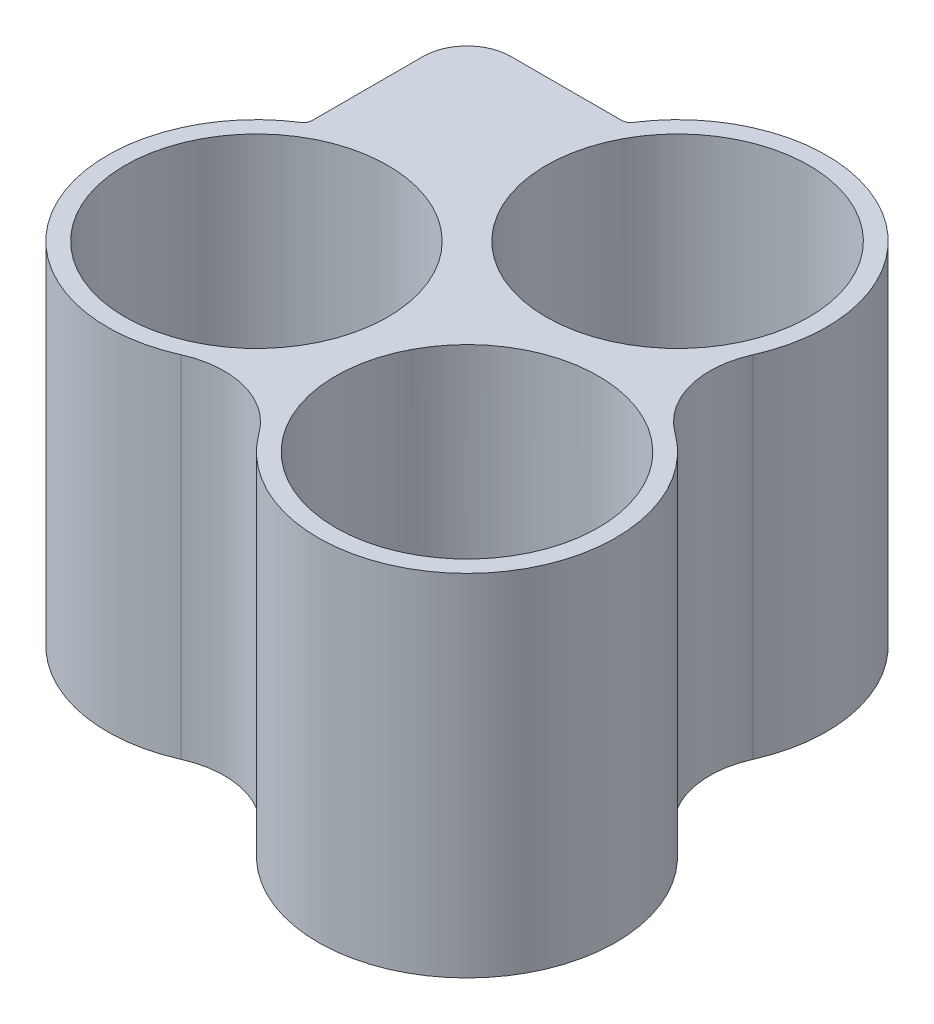
ISO-10303-21;
HEADER;
FILE_DESCRIPTION(('STEP AP214'),'2;1');
FILE_NAME('part.step','',(''),(''),'','','');
FILE_SCHEMA(('AUTOMOTIVE_DESIGN { 1 0 10303 214 1 1 1 1 }'));
ENDSEC;
DATA;
#1=APPLICATION_CONTEXT('core data for automotive mechanical design processes');
#2=APPLICATION_PROTOCOL_DEFINITION('international standard','automotive_design',2000,#1);
#3=PRODUCT_CONTEXT('',#1,'mechanical');
#4=PRODUCT('Part','Part','',(#3));
#5=PRODUCT_RELATED_PRODUCT_CATEGORY('part','',(#4));
#6=PRODUCT_DEFINITION_FORMATION('','',#4);
#7=PRODUCT_DEFINITION_CONTEXT('part definition',#1,'design');
#8=PRODUCT_DEFINITION('design','',#6,#7);
#9=PRODUCT_DEFINITION_SHAPE('','',#8);
#10=(LENGTH_UNIT() NAMED_UNIT(*) SI_UNIT(.MILLI.,.METRE.));
#11=(NAMED_UNIT(*) PLANE_ANGLE_UNIT() SI_UNIT($,.RADIAN.));
#12=(NAMED_UNIT(*) SI_UNIT($,.STERADIAN.) SOLID_ANGLE_UNIT());
#13=UNCERTAINTY_MEASURE_WITH_UNIT(LENGTH_MEASURE(1.E-05),#10,'distance_accuracy_value','');
#14=(GEOMETRIC_REPRESENTATION_CONTEXT(3) GLOBAL_UNCERTAINTY_ASSIGNED_CONTEXT((#13)) GLOBAL_UNIT_ASSIGNED_CONTEXT((#10,
#11,#12)) REPRESENTATION_CONTEXT('',''));
#15=CARTESIAN_POINT('',(0.,0.,0.));
#16=DIRECTION('',(0.,0.,1.));
#17=DIRECTION('',(1.,0.,0.));
#18=AXIS2_PLACEMENT_3D('',#15,#16,#17);
#19=CARTESIAN_POINT('',(27.5914780938285,79.3008579244928,27.5914780938281));
#20=DIRECTION('',(0.,1.,0.));
#21=DIRECTION('',(0.,0.,1.));
#22=AXIS2_PLACEMENT_3D('',#19,#20,#21);
#23=CYLINDRICAL_SURFACE('',#22,14.9999999999972);
#24=CARTESIAN_POINT('',(27.5914780938283,154.5,27.5914780938283));
#25=DIRECTION('',(0.,-1.,0.));
#26=DIRECTION('',(0.,0.,-1.));
#27=AXIS2_PLACEMENT_3D('',#24,#25,#26);
#28=CIRCLE('',#27,14.9999999999972);
#29=CARTESIAN_POINT('',(27.5914780938283,154.5,12.5914780938311));
#30=VERTEX_POINT('',#29);
#31=EDGE_CURVE('E139',#30,#30,#28,.T.);
#32=ORIENTED_EDGE('',*,*,#31,.T.);
#33=EDGE_LOOP('',(#32));
#34=FACE_BOUND('',#33,.T.);
#35=CARTESIAN_POINT('',(27.5914780938285,180.,27.5914780938281));
#36=DIRECTION('',(0.,1.,0.));
#37=DIRECTION('',(0.,0.,1.));
#38=AXIS2_PLACEMENT_3D('',#35,#36,#37);
#39=CIRCLE('',#38,14.9999999999972);
#40=CARTESIAN_POINT('',(27.5914780938285,180.,42.5914780938253));
#41=VERTEX_POINT('',#40);
#42=EDGE_CURVE('E163',#41,#41,#39,.T.);
#43=ORIENTED_EDGE('',*,*,#42,.T.);
#44=EDGE_LOOP('',(#43));
#45=FACE_BOUND('',#44,.T.);
#46=ADVANCED_FACE('F40',(#34,#45),#23,.F.);
#47=CARTESIAN_POINT('',(-5.24999999999985,140.,18.7916305603424));
#48=DIRECTION('',(0.,1.,0.));
#49=DIRECTION('',(0.,0.,1.));
#50=AXIS2_PLACEMENT_3D('',#47,#48,#49);
#51=CYLINDRICAL_SURFACE('',#50,17.);
#52=CARTESIAN_POINT('',(-5.24999999999985,140.,18.7916305603424));
#53=DIRECTION('',(0.,1.,0.));
#54=DIRECTION('',(0.,0.,1.));
#55=AXIS2_PLACEMENT_3D('',#52,#53,#54);
#56=CIRCLE('',#55,17.);
#57=CARTESIAN_POINT('',(-14.4583333333332,140.,4.5015431840447));
#58=VERTEX_POINT('',#57);
#59=CARTESIAN_POINT('',(1.67070312003183,140.,34.3191502696966));
#60=VERTEX_POINT('',#59);
#61=EDGE_CURVE('E208',#58,#60,#56,.T.);
#62=ORIENTED_EDGE('',*,*,#61,.T.);
#63=DIRECTION('',(0.,1.,0.));
#64=VECTOR('',#63,1.);
#65=CARTESIAN_POINT('',(1.67070312003183,79.3008579244928,34.3191502696966));
#66=LINE('',#65,#64);
#67=CARTESIAN_POINT('',(1.67070312003183,180.,34.3191502696966));
#68=VERTEX_POINT('',#67);
#69=EDGE_CURVE('E150',#60,#68,#66,.T.);
#70=ORIENTED_EDGE('',*,*,#69,.T.);
#71=CARTESIAN_POINT('',(-5.24999999999985,180.,18.7916305603424));
#72=DIRECTION('',(0.,1.,0.));
#73=DIRECTION('',(0.,0.,1.));
#74=AXIS2_PLACEMENT_3D('',#71,#72,#73);
#75=CIRCLE('',#74,17.);
#76=CARTESIAN_POINT('',(-14.4583333333332,180.,4.5015431840447));
#77=VERTEX_POINT('',#76);
#78=EDGE_CURVE('E205',#77,#68,#75,.T.);
#79=ORIENTED_EDGE('',*,*,#78,.F.);
#80=DIRECTION('',(0.,1.,0.));
#81=VECTOR('',#80,1.);
#82=CARTESIAN_POINT('',(-14.4583333333332,140.,4.5015431840447));
#83=LINE('',#82,#81);
#84=EDGE_CURVE('E223',#77,#58,#83,.F.);
#85=ORIENTED_EDGE('',*,*,#84,.T.);
#86=EDGE_LOOP('',(#62,#70,#79,#85));
#87=FACE_BOUND('',#86,.T.);
#88=ADVANCED_FACE('F262',(#87),#51,.T.);
#89=CARTESIAN_POINT('',(18.7916305603428,140.,-5.25000000000024));
#90=DIRECTION('',(0.,1.,0.));
#91=DIRECTION('',(0.,0.,1.));
#92=AXIS2_PLACEMENT_3D('',#89,#90,#91);
#93=CYLINDRICAL_SURFACE('',#92,15.);
#94=CARTESIAN_POINT('',(18.7916305603421,154.5,-5.24999999999985));
#95=DIRECTION('',(0.,-1.,0.));
#96=DIRECTION('',(1.,0.,0.));
#97=AXIS2_PLACEMENT_3D('',#94,#95,#96);
#98=CIRCLE('',#97,14.9999999999997);
#99=CARTESIAN_POINT('',(33.7916305603418,154.5,-5.24999999999986));
#100=VERTEX_POINT('',#99);
#101=EDGE_CURVE('E184',#100,#100,#98,.T.);
#102=ORIENTED_EDGE('',*,*,#101,.T.);
#103=EDGE_LOOP('',(#102));
#104=FACE_BOUND('',#103,.T.);
#105=CARTESIAN_POINT('',(18.7916305603428,180.,-5.25000000000024));
#106=DIRECTION('',(0.,1.,0.));
#107=DIRECTION('',(0.,0.,1.));
#108=AXIS2_PLACEMENT_3D('',#105,#106,#107);
#109=CIRCLE('',#108,15.);
#110=CARTESIAN_POINT('',(18.7916305603428,180.,9.74999999999975));
#111=VERTEX_POINT('',#110);
#112=EDGE_CURVE('E202',#111,#111,#109,.T.);
#113=ORIENTED_EDGE('',*,*,#112,.T.);
#114=EDGE_LOOP('',(#113));
#115=FACE_BOUND('',#114,.T.);
#116=ADVANCED_FACE('F264',(#104,#115),#93,.F.);
#117=CARTESIAN_POINT('',(-5.24999999999985,140.,18.7916305603424));
#118=DIRECTION('',(0.,1.,0.));
#119=DIRECTION('',(0.,0.,1.));
#120=AXIS2_PLACEMENT_3D('',#117,#118,#119);
#121=CYLINDRICAL_SURFACE('',#120,15.);
#122=CARTESIAN_POINT('',(-5.24999999999985,154.5,18.7916305603421));
#123=DIRECTION('',(0.,1.,0.));
#124=DIRECTION('',(0.,0.,1.));
#125=AXIS2_PLACEMENT_3D('',#122,#123,#124);
#126=CIRCLE('',#125,14.9999999999997);
#127=CARTESIAN_POINT('',(-5.24999999999985,154.5,33.7916305603418));
#128=VERTEX_POINT('',#127);
#129=EDGE_CURVE('E190',#128,#128,#126,.T.);
#130=ORIENTED_EDGE('',*,*,#129,.F.);
#131=EDGE_LOOP('',(#130));
#132=FACE_BOUND('',#131,.T.);
#133=CARTESIAN_POINT('',(-5.24999999999985,180.,18.7916305603424));
#134=DIRECTION('',(0.,1.,0.));
#135=DIRECTION('',(0.,0.,1.));
#136=AXIS2_PLACEMENT_3D('',#133,#134,#135);
#137=CIRCLE('',#136,15.);
#138=CARTESIAN_POINT('',(-5.24999999999985,180.,33.7916305603424));
#139=VERTEX_POINT('',#138);
#140=EDGE_CURVE('E197',#139,#139,#137,.T.);
#141=ORIENTED_EDGE('',*,*,#140,.T.);
#142=EDGE_LOOP('',(#141));
#143=FACE_BOUND('',#142,.T.);
#144=ADVANCED_FACE('F270',(#132,#143),#121,.F.);
#145=CARTESIAN_POINT('',(18.7916305603421,142.,-5.24999999999985));
#146=DIRECTION('',(0.,1.,0.));
#147=DIRECTION('',(1.,0.,0.));
#148=AXIS2_PLACEMENT_3D('',#145,#146,#147);
#149=CONICAL_SURFACE('',#148,7.49999999999973,0.540419500270583);
#150=ORIENTED_EDGE('',*,*,#101,.F.);
#151=EDGE_LOOP('',(#150));
#152=FACE_BOUND('',#151,.T.);
#153=CARTESIAN_POINT('',(18.7916305603421,142.,-5.24999999999985));
#154=DIRECTION('',(0.,-1.,0.));
#155=DIRECTION('',(1.,0.,0.));
#156=AXIS2_PLACEMENT_3D('',#153,#154,#155);
#157=CIRCLE('',#156,7.49999999999973);
#158=CARTESIAN_POINT('',(26.2916305603418,142.,-5.24999999999986));
#159=VERTEX_POINT('',#158);
#160=EDGE_CURVE('E156',#159,#159,#157,.T.);
#161=ORIENTED_EDGE('',*,*,#160,.T.);
#162=EDGE_LOOP('',(#161));
#163=FACE_BOUND('',#162,.T.);
#164=ADVANCED_FACE('F448',(#152,#163),#149,.F.);
#165=CARTESIAN_POINT('',(-5.24999999999985,142.,18.7916305603421));
#166=DIRECTION('',(0.,1.,0.));
#167=DIRECTION('',(0.,0.,1.));
#168=AXIS2_PLACEMENT_3D('',#165,#166,#167);
#169=CONICAL_SURFACE('',#168,7.49999999999973,0.540419500270583);
#170=ORIENTED_EDGE('',*,*,#129,.T.);
#171=EDGE_LOOP('',(#170));
#172=FACE_BOUND('',#171,.T.);
#173=CARTESIAN_POINT('',(-5.24999999999985,142.,18.7916305603424));
#174=DIRECTION('',(0.,-1.,0.));
#175=DIRECTION('',(0.,0.,-1.));
#176=AXIS2_PLACEMENT_3D('',#173,#174,#175);
#177=CIRCLE('',#176,7.5);
#178=CARTESIAN_POINT('',(-5.24999999999985,142.,11.2916305603424));
#179=VERTEX_POINT('',#178);
#180=EDGE_CURVE('E194',#179,#179,#177,.T.);
#181=ORIENTED_EDGE('',*,*,#180,.T.);
#182=EDGE_LOOP('',(#181));
#183=FACE_BOUND('',#182,.T.);
#184=ADVANCED_FACE('F286',(#172,#183),#169,.F.);
#185=CARTESIAN_POINT('',(0.,180.,0.));
#186=DIRECTION('',(0.,1.,0.));
#187=DIRECTION('',(0.,0.,1.));
#188=AXIS2_PLACEMENT_3D('',#185,#186,#187);
#189=PLANE('',#188);
#190=DIRECTION('',(-1.,0.,0.));
#191=VECTOR('',#190,1.);
#192=CARTESIAN_POINT('',(1.25000000000015,180.,-14.0000000000002));
#193=LINE('',#192,#191);
#194=CARTESIAN_POINT('',(3.66094980896876,180.,-14.0000000000002));
#195=VERTEX_POINT('',#194);
#196=CARTESIAN_POINT('',(-8.99999999999981,180.,-14.0000000000002));
#197=VERTEX_POINT('',#196);
#198=EDGE_CURVE('E212',#195,#197,#193,.T.);
#199=ORIENTED_EDGE('',*,*,#198,.T.);
#200=CARTESIAN_POINT('',(-8.99999999999985,180.,-9.00000000000023));
#201=DIRECTION('',(0.,1.,0.));
#202=DIRECTION('',(0.,0.,-1.));
#203=AXIS2_PLACEMENT_3D('',#200,#201,#202);
#204=CIRCLE('',#203,5.);
#205=CARTESIAN_POINT('',(-13.9999999999998,180.,-9.0000000000002));
#206=VERTEX_POINT('',#205);
#207=EDGE_CURVE('E136',#197,#206,#204,.T.);
#208=ORIENTED_EDGE('',*,*,#207,.T.);
#209=DIRECTION('',(0.,0.,1.));
#210=VECTOR('',#209,1.);
#211=CARTESIAN_POINT('',(-13.9999999999998,180.,1.24999999999976));
#212=LINE('',#211,#210);
#213=CARTESIAN_POINT('',(-13.9999999999998,180.,3.66094980896837));
#214=VERTEX_POINT('',#213);
#215=EDGE_CURVE('E214',#206,#214,#212,.T.);
#216=ORIENTED_EDGE('',*,*,#215,.T.);
#217=CARTESIAN_POINT('',(-14.9999999999998,180.,3.66094980896837));
#218=DIRECTION('',(0.,1.,0.));
#219=DIRECTION('',(0.,0.,1.));
#220=AXIS2_PLACEMENT_3D('',#217,#218,#219);
#221=CIRCLE('',#220,1.);
#222=EDGE_CURVE('E229',#214,#77,#221,.F.);
#223=ORIENTED_EDGE('',*,*,#222,.T.);
#224=ORIENTED_EDGE('',*,*,#78,.T.);
#225=CARTESIAN_POINT('',(5.74170495534458,180.,43.4529853928462));
#226=DIRECTION('',(0.,-1.,0.));
#227=DIRECTION('',(0.,0.,1.));
#228=AXIS2_PLACEMENT_3D('',#225,#226,#227);
#229=CIRCLE('',#228,10.);
#230=CARTESIAN_POINT('',(13.8342135251534,180.,37.5783530598765));
#231=VERTEX_POINT('',#230);
#232=EDGE_CURVE('E160',#68,#231,#229,.T.);
#233=ORIENTED_EDGE('',*,*,#232,.T.);
#234=CARTESIAN_POINT('',(27.5914780938285,180.,27.5914780938281));
#235=DIRECTION('',(0.,1.,0.));
#236=DIRECTION('',(0.,0.,1.));
#237=AXIS2_PLACEMENT_3D('',#234,#235,#236);
#238=CIRCLE('',#237,17.0000000000002);
#239=CARTESIAN_POINT('',(37.5783530598767,180.,13.834213525153));
#240=VERTEX_POINT('',#239);
#241=EDGE_CURVE('E157',#231,#240,#238,.T.);
#242=ORIENTED_EDGE('',*,*,#241,.T.);
#243=CARTESIAN_POINT('',(43.4529853928462,180.,5.74170495534414));
#244=DIRECTION('',(0.,-1.,0.));
#245=DIRECTION('',(0.,0.,-1.));
#246=AXIS2_PLACEMENT_3D('',#243,#244,#245);
#247=CIRCLE('',#246,10.);
#248=CARTESIAN_POINT('',(34.319150269697,180.,1.67070312003149));
#249=VERTEX_POINT('',#248);
#250=EDGE_CURVE('E153',#240,#249,#247,.T.);
#251=ORIENTED_EDGE('',*,*,#250,.T.);
#252=CARTESIAN_POINT('',(18.7916305603428,180.,-5.25000000000024));
#253=DIRECTION('',(0.,1.,0.));
#254=DIRECTION('',(0.,0.,1.));
#255=AXIS2_PLACEMENT_3D('',#252,#253,#254);
#256=CIRCLE('',#255,17.);
#257=CARTESIAN_POINT('',(4.50154318404509,180.,-14.4583333333336));
#258=VERTEX_POINT('',#257);
#259=EDGE_CURVE('E62',#249,#258,#256,.T.);
#260=ORIENTED_EDGE('',*,*,#259,.T.);
#261=CARTESIAN_POINT('',(3.66094980896876,180.,-15.0000000000002));
#262=DIRECTION('',(0.,1.,0.));
#263=DIRECTION('',(0.,0.,1.));
#264=AXIS2_PLACEMENT_3D('',#261,#262,#263);
#265=CIRCLE('',#264,1.);
#266=EDGE_CURVE('E225',#258,#195,#265,.F.);
#267=ORIENTED_EDGE('',*,*,#266,.T.);
#268=EDGE_LOOP('',(#199,#208,#216,#223,#224,#233,#242,#251,#260,#267));
#269=FACE_BOUND('',#268,.T.);
#270=ORIENTED_EDGE('',*,*,#140,.F.);
#271=EDGE_LOOP('',(#270));
#272=FACE_BOUND('',#271,.T.);
#273=ORIENTED_EDGE('',*,*,#112,.F.);
#274=EDGE_LOOP('',(#273));
#275=FACE_BOUND('',#274,.T.);
#276=ORIENTED_EDGE('',*,*,#42,.F.);
#277=EDGE_LOOP('',(#276));
#278=FACE_BOUND('',#277,.T.);
#279=ADVANCED_FACE('F241',(#269,#272,#275,#278),#189,.T.);
#280=CARTESIAN_POINT('',(18.7916305603424,142.,-5.24999999999985));
#281=DIRECTION('',(0.,-1.,0.));
#282=DIRECTION('',(0.,0.,-1.));
#283=AXIS2_PLACEMENT_3D('',#280,#281,#282);
#284=CYLINDRICAL_SURFACE('',#283,7.5);
#285=ORIENTED_EDGE('',*,*,#160,.F.);
#286=EDGE_LOOP('',(#285));
#287=FACE_BOUND('',#286,.T.);
#288=CARTESIAN_POINT('',(18.7916305603424,140.,-5.24999999999985));
#289=DIRECTION('',(0.,1.,0.));
#290=DIRECTION('',(-1.,0.,0.));
#291=AXIS2_PLACEMENT_3D('',#288,#289,#290);
#292=CIRCLE('',#291,7.5);
#293=CARTESIAN_POINT('',(11.2916305603424,140.,-5.24999999999985));
#294=VERTEX_POINT('',#293);
#295=EDGE_CURVE('E187',#294,#294,#292,.T.);
#296=ORIENTED_EDGE('',*,*,#295,.F.);
#297=EDGE_LOOP('',(#296));
#298=FACE_BOUND('',#297,.T.);
#299=ADVANCED_FACE('F285',(#287,#298),#284,.F.);
#300=CARTESIAN_POINT('',(-5.24999999999985,142.,18.7916305603424));
#301=DIRECTION('',(0.,-1.,0.));
#302=DIRECTION('',(0.,0.,-1.));
#303=AXIS2_PLACEMENT_3D('',#300,#301,#302);
#304=CYLINDRICAL_SURFACE('',#303,7.5);
#305=ORIENTED_EDGE('',*,*,#180,.F.);
#306=EDGE_LOOP('',(#305));
#307=FACE_BOUND('',#306,.T.);
#308=CARTESIAN_POINT('',(-5.24999999999985,140.,18.7916305603424));
#309=DIRECTION('',(0.,-1.,0.));
#310=DIRECTION('',(0.,0.,-1.));
#311=AXIS2_PLACEMENT_3D('',#308,#309,#310);
#312=CIRCLE('',#311,7.5);
#313=CARTESIAN_POINT('',(-5.24999999999985,140.,11.2916305603424));
#314=VERTEX_POINT('',#313);
#315=EDGE_CURVE('E193',#314,#314,#312,.T.);
#316=ORIENTED_EDGE('',*,*,#315,.T.);
#317=EDGE_LOOP('',(#316));
#318=FACE_BOUND('',#317,.T.);
#319=ADVANCED_FACE('F283',(#307,#318),#304,.F.);
#320=CARTESIAN_POINT('',(18.7916305603428,140.,-5.25000000000024));
#321=DIRECTION('',(0.,1.,0.));
#322=DIRECTION('',(0.,0.,1.));
#323=AXIS2_PLACEMENT_3D('',#320,#321,#322);
#324=CYLINDRICAL_SURFACE('',#323,17.);
#325=DIRECTION('',(0.,1.,0.));
#326=VECTOR('',#325,1.);
#327=CARTESIAN_POINT('',(34.3191502696968,79.3008579244928,1.67070312003155));
#328=LINE('',#327,#326);
#329=CARTESIAN_POINT('',(34.3191502696966,140.,1.67070312003149));
#330=VERTEX_POINT('',#329);
#331=EDGE_CURVE('E174',#330,#249,#328,.T.);
#332=ORIENTED_EDGE('',*,*,#331,.F.);
#333=CARTESIAN_POINT('',(18.7916305603428,140.,-5.25000000000024));
#334=DIRECTION('',(0.,1.,0.));
#335=DIRECTION('',(0.,0.,1.));
#336=AXIS2_PLACEMENT_3D('',#333,#334,#335);
#337=CIRCLE('',#336,17.);
#338=CARTESIAN_POINT('',(4.50154318404509,140.,-14.4583333333336));
#339=VERTEX_POINT('',#338);
#340=EDGE_CURVE('E127',#330,#339,#337,.T.);
#341=ORIENTED_EDGE('',*,*,#340,.T.);
#342=DIRECTION('',(0.,1.,0.));
#343=VECTOR('',#342,1.);
#344=CARTESIAN_POINT('',(4.50154318404509,140.,-14.4583333333336));
#345=LINE('',#344,#343);
#346=EDGE_CURVE('E210',#339,#258,#345,.T.);
#347=ORIENTED_EDGE('',*,*,#346,.T.);
#348=ORIENTED_EDGE('',*,*,#259,.F.);
#349=EDGE_LOOP('',(#332,#341,#347,#348));
#350=FACE_BOUND('',#349,.T.);
#351=ADVANCED_FACE('F248',(#350),#324,.T.);
#352=CARTESIAN_POINT('',(3.66094980896876,140.,-15.0000000000002));
#353=DIRECTION('',(0.,1.,0.));
#354=DIRECTION('',(0.,0.,1.));
#355=AXIS2_PLACEMENT_3D('',#352,#353,#354);
#356=CYLINDRICAL_SURFACE('',#355,1.);
#357=CARTESIAN_POINT('',(3.66094980896876,140.,-15.0000000000002));
#358=DIRECTION('',(0.,-1.,0.));
#359=DIRECTION('',(0.,0.,-1.));
#360=AXIS2_PLACEMENT_3D('',#357,#358,#359);
#361=CIRCLE('',#360,1.);
#362=CARTESIAN_POINT('',(3.66094980896876,140.,-14.0000000000002));
#363=VERTEX_POINT('',#362);
#364=EDGE_CURVE('E227',#363,#339,#361,.F.);
#365=ORIENTED_EDGE('',*,*,#364,.F.);
#366=DIRECTION('',(0.,-1.,0.));
#367=VECTOR('',#366,1.);
#368=CARTESIAN_POINT('',(3.66094980896876,140.,-14.0000000000002));
#369=LINE('',#368,#367);
#370=EDGE_CURVE('E124',#195,#363,#369,.T.);
#371=ORIENTED_EDGE('',*,*,#370,.F.);
#372=ORIENTED_EDGE('',*,*,#266,.F.);
#373=ORIENTED_EDGE('',*,*,#346,.F.);
#374=EDGE_LOOP('',(#365,#371,#372,#373));
#375=FACE_BOUND('',#374,.T.);
#376=ADVANCED_FACE('F245',(#375),#356,.F.);
#377=CARTESIAN_POINT('',(1.25000000000015,140.,-14.0000000000002));
#378=DIRECTION('',(0.,0.,-1.));
#379=DIRECTION('',(-1.,0.,0.));
#380=AXIS2_PLACEMENT_3D('',#377,#378,#379);
#381=PLANE('',#380);
#382=DIRECTION('',(-1.,0.,0.));
#383=VECTOR('',#382,1.);
#384=CARTESIAN_POINT('',(1.25000000000015,140.,-14.0000000000002));
#385=LINE('',#384,#383);
#386=CARTESIAN_POINT('',(-8.99999999999981,140.,-14.0000000000002));
#387=VERTEX_POINT('',#386);
#388=EDGE_CURVE('E117',#363,#387,#385,.T.);
#389=ORIENTED_EDGE('',*,*,#388,.T.);
#390=DIRECTION('',(0.,1.,0.));
#391=VECTOR('',#390,1.);
#392=CARTESIAN_POINT('',(-8.99999999999981,-182.980970388563,-14.0000000000002));
#393=LINE('',#392,#391);
#394=EDGE_CURVE('E121',#387,#197,#393,.T.);
#395=ORIENTED_EDGE('',*,*,#394,.T.);
#396=ORIENTED_EDGE('',*,*,#198,.F.);
#397=ORIENTED_EDGE('',*,*,#370,.T.);
#398=EDGE_LOOP('',(#389,#395,#396,#397));
#399=FACE_BOUND('',#398,.T.);
#400=ADVANCED_FACE('F118',(#399),#381,.T.);
#401=CARTESIAN_POINT('',(-13.9999999999998,140.,1.24999999999976));
#402=DIRECTION('',(-1.,0.,0.));
#403=DIRECTION('',(0.,0.,1.));
#404=AXIS2_PLACEMENT_3D('',#401,#402,#403);
#405=PLANE('',#404);
#406=DIRECTION('',(0.,1.,0.));
#407=VECTOR('',#406,1.);
#408=CARTESIAN_POINT('',(-13.9999999999998,-182.980970388563,-9.0000000000002));
#409=LINE('',#408,#407);
#410=CARTESIAN_POINT('',(-13.9999999999998,140.,-9.0000000000002));
#411=VERTEX_POINT('',#410);
#412=EDGE_CURVE('E137',#411,#206,#409,.T.);
#413=ORIENTED_EDGE('',*,*,#412,.F.);
#414=DIRECTION('',(0.,0.,1.));
#415=VECTOR('',#414,1.);
#416=CARTESIAN_POINT('',(-13.9999999999998,140.,1.24999999999976));
#417=LINE('',#416,#415);
#418=CARTESIAN_POINT('',(-13.9999999999998,140.,3.66094980896837));
#419=VERTEX_POINT('',#418);
#420=EDGE_CURVE('E54',#411,#419,#417,.T.);
#421=ORIENTED_EDGE('',*,*,#420,.T.);
#422=DIRECTION('',(0.,-1.,0.));
#423=VECTOR('',#422,1.);
#424=CARTESIAN_POINT('',(-13.9999999999998,180.,3.66094980896837));
#425=LINE('',#424,#423);
#426=EDGE_CURVE('E220',#419,#214,#425,.F.);
#427=ORIENTED_EDGE('',*,*,#426,.T.);
#428=ORIENTED_EDGE('',*,*,#215,.F.);
#429=EDGE_LOOP('',(#413,#421,#427,#428));
#430=FACE_BOUND('',#429,.T.);
#431=ADVANCED_FACE('F239',(#430),#405,.T.);
#432=CARTESIAN_POINT('',(-14.9999999999998,140.,3.66094980896837));
#433=DIRECTION('',(0.,1.,0.));
#434=DIRECTION('',(0.,0.,1.));
#435=AXIS2_PLACEMENT_3D('',#432,#433,#434);
#436=CYLINDRICAL_SURFACE('',#435,1.);
#437=CARTESIAN_POINT('',(-14.9999999999998,140.,3.66094980896837));
#438=DIRECTION('',(0.,-1.,0.));
#439=DIRECTION('',(0.,0.,-1.));
#440=AXIS2_PLACEMENT_3D('',#437,#438,#439);
#441=CIRCLE('',#440,1.);
#442=EDGE_CURVE('E48',#58,#419,#441,.F.);
#443=ORIENTED_EDGE('',*,*,#442,.F.);
#444=ORIENTED_EDGE('',*,*,#84,.F.);
#445=ORIENTED_EDGE('',*,*,#222,.F.);
#446=ORIENTED_EDGE('',*,*,#426,.F.);
#447=EDGE_LOOP('',(#443,#444,#445,#446));
#448=FACE_BOUND('',#447,.T.);
#449=ADVANCED_FACE('F42',(#448),#436,.F.);
#450=CARTESIAN_POINT('',(21.6032122543628,140.,21.6032122543624));
#451=DIRECTION('',(0.,-1.,0.));
#452=DIRECTION('',(0.,0.,-1.));
#453=AXIS2_PLACEMENT_3D('',#450,#451,#452);
#454=PLANE('',#453);
#455=CARTESIAN_POINT('',(-5.87499999999985,140.,-5.87500000000023));
#456=DIRECTION('',(0.,-1.,0.));
#457=DIRECTION('',(0.,0.,-1.));
#458=AXIS2_PLACEMENT_3D('',#455,#456,#457);
#459=CIRCLE('',#458,5.);
#460=CARTESIAN_POINT('',(-5.87499999999985,140.,-10.8750000000002));
#461=VERTEX_POINT('',#460);
#462=EDGE_CURVE('E576',#461,#461,#459,.T.);
#463=ORIENTED_EDGE('',*,*,#462,.F.);
#464=EDGE_LOOP('',(#463));
#465=FACE_BOUND('',#464,.T.);
#466=ORIENTED_EDGE('',*,*,#295,.T.);
#467=EDGE_LOOP('',(#466));
#468=FACE_BOUND('',#467,.T.);
#469=ORIENTED_EDGE('',*,*,#364,.T.);
#470=ORIENTED_EDGE('',*,*,#340,.F.);
#471=CARTESIAN_POINT('',(43.4529853928462,140.,5.74170495534414));
#472=DIRECTION('',(0.,-1.,0.));
#473=DIRECTION('',(0.,0.,-1.));
#474=AXIS2_PLACEMENT_3D('',#471,#472,#473);
#475=CIRCLE('',#474,10.);
#476=CARTESIAN_POINT('',(37.5783530598768,140.,13.8342135251529));
#477=VERTEX_POINT('',#476);
#478=EDGE_CURVE('E171',#477,#330,#475,.T.);
#479=ORIENTED_EDGE('',*,*,#478,.F.);
#480=CARTESIAN_POINT('',(27.5914780938285,140.,27.5914780938281));
#481=DIRECTION('',(0.,-1.,0.));
#482=DIRECTION('',(0.,0.,-1.));
#483=AXIS2_PLACEMENT_3D('',#480,#481,#482);
#484=CIRCLE('',#483,17.0000000000002);
#485=CARTESIAN_POINT('',(13.8342135251534,140.,37.5783530598765));
#486=VERTEX_POINT('',#485);
#487=EDGE_CURVE('E175',#486,#477,#484,.F.);
#488=ORIENTED_EDGE('',*,*,#487,.F.);
#489=CARTESIAN_POINT('',(5.74170495534458,140.,43.4529853928462));
#490=DIRECTION('',(0.,-1.,0.));
#491=DIRECTION('',(0.,0.,-1.));
#492=AXIS2_PLACEMENT_3D('',#489,#490,#491);
#493=CIRCLE('',#492,10.);
#494=EDGE_CURVE('E167',#60,#486,#493,.T.);
#495=ORIENTED_EDGE('',*,*,#494,.F.);
#496=ORIENTED_EDGE('',*,*,#61,.F.);
#497=ORIENTED_EDGE('',*,*,#442,.T.);
#498=ORIENTED_EDGE('',*,*,#420,.F.);
#499=CARTESIAN_POINT('',(-8.99999999999985,140.,-9.00000000000023));
#500=DIRECTION('',(0.,1.,0.));
#501=DIRECTION('',(0.,0.,1.));
#502=AXIS2_PLACEMENT_3D('',#499,#500,#501);
#503=CIRCLE('',#502,5.);
#504=EDGE_CURVE('E12',#411,#387,#503,.F.);
#505=ORIENTED_EDGE('',*,*,#504,.T.);
#506=ORIENTED_EDGE('',*,*,#388,.F.);
#507=EDGE_LOOP('',(#469,#470,#479,#488,#495,#496,#497,#498,#505,#506));
#508=FACE_BOUND('',#507,.T.);
#509=ORIENTED_EDGE('',*,*,#315,.F.);
#510=EDGE_LOOP('',(#509));
#511=FACE_BOUND('',#510,.T.);
#512=CARTESIAN_POINT('',(27.5914780938285,140.,27.5914780938281));
#513=DIRECTION('',(0.,-1.,0.));
#514=DIRECTION('',(0.,0.,-1.));
#515=AXIS2_PLACEMENT_3D('',#512,#513,#514);
#516=CIRCLE('',#515,7.5);
#517=CARTESIAN_POINT('',(27.5914780938285,140.,20.0914780938281));
#518=VERTEX_POINT('',#517);
#519=EDGE_CURVE('E146',#518,#518,#516,.T.);
#520=ORIENTED_EDGE('',*,*,#519,.F.);
#521=EDGE_LOOP('',(#520));
#522=FACE_BOUND('',#521,.T.);
#523=ADVANCED_FACE('F129',(#465,#468,#508,#511,#522),#454,.T.);
#524=CARTESIAN_POINT('',(43.4529853928462,79.3008579244928,5.74170495534414));
#525=DIRECTION('',(0.,1.,0.));
#526=DIRECTION('',(0.,0.,1.));
#527=AXIS2_PLACEMENT_3D('',#524,#525,#526);
#528=CYLINDRICAL_SURFACE('',#527,10.);
#529=DIRECTION('',(0.,1.,0.));
#530=VECTOR('',#529,1.);
#531=CARTESIAN_POINT('',(37.5783530598767,79.3008579244928,13.834213525153));
#532=LINE('',#531,#530);
#533=EDGE_CURVE('E170',#477,#240,#532,.T.);
#534=ORIENTED_EDGE('',*,*,#533,.F.);
#535=ORIENTED_EDGE('',*,*,#478,.T.);
#536=ORIENTED_EDGE('',*,*,#331,.T.);
#537=ORIENTED_EDGE('',*,*,#250,.F.);
#538=EDGE_LOOP('',(#534,#535,#536,#537));
#539=FACE_BOUND('',#538,.T.);
#540=ADVANCED_FACE('F251',(#539),#528,.F.);
#541=CARTESIAN_POINT('',(27.5914780938285,79.3008579244928,27.5914780938281));
#542=DIRECTION('',(0.,1.,0.));
#543=DIRECTION('',(0.,0.,1.));
#544=AXIS2_PLACEMENT_3D('',#541,#542,#543);
#545=CYLINDRICAL_SURFACE('',#544,17.0000000000002);
#546=DIRECTION('',(0.,1.,0.));
#547=VECTOR('',#546,1.);
#548=CARTESIAN_POINT('',(13.8342135251534,79.3008579244928,37.5783530598765));
#549=LINE('',#548,#547);
#550=EDGE_CURVE('E166',#486,#231,#549,.T.);
#551=ORIENTED_EDGE('',*,*,#550,.F.);
#552=ORIENTED_EDGE('',*,*,#487,.T.);
#553=ORIENTED_EDGE('',*,*,#533,.T.);
#554=ORIENTED_EDGE('',*,*,#241,.F.);
#555=EDGE_LOOP('',(#551,#552,#553,#554));
#556=FACE_BOUND('',#555,.T.);
#557=ADVANCED_FACE('F255',(#556),#545,.T.);
#558=CARTESIAN_POINT('',(5.74170495534458,79.3008579244928,43.4529853928462));
#559=DIRECTION('',(0.,1.,0.));
#560=DIRECTION('',(0.,0.,1.));
#561=AXIS2_PLACEMENT_3D('',#558,#559,#560);
#562=CYLINDRICAL_SURFACE('',#561,10.);
#563=ORIENTED_EDGE('',*,*,#69,.F.);
#564=ORIENTED_EDGE('',*,*,#494,.T.);
#565=ORIENTED_EDGE('',*,*,#550,.T.);
#566=ORIENTED_EDGE('',*,*,#232,.F.);
#567=EDGE_LOOP('',(#563,#564,#565,#566));
#568=FACE_BOUND('',#567,.T.);
#569=ADVANCED_FACE('F259',(#568),#562,.F.);
#570=CARTESIAN_POINT('',(27.5914780938285,142.,27.5914780938281));
#571=DIRECTION('',(0.,-1.,0.));
#572=DIRECTION('',(0.,0.,-1.));
#573=AXIS2_PLACEMENT_3D('',#570,#571,#572);
#574=CYLINDRICAL_SURFACE('',#573,7.5);
#575=CARTESIAN_POINT('',(27.5914780938285,142.,27.5914780938281));
#576=DIRECTION('',(0.,-1.,0.));
#577=DIRECTION('',(0.,0.,-1.));
#578=AXIS2_PLACEMENT_3D('',#575,#576,#577);
#579=CIRCLE('',#578,7.5);
#580=CARTESIAN_POINT('',(27.5914780938285,142.,20.0914780938281));
#581=VERTEX_POINT('',#580);
#582=EDGE_CURVE('E147',#581,#581,#579,.T.);
#583=ORIENTED_EDGE('',*,*,#582,.F.);
#584=EDGE_LOOP('',(#583));
#585=FACE_BOUND('',#584,.T.);
#586=ORIENTED_EDGE('',*,*,#519,.T.);
#587=EDGE_LOOP('',(#586));
#588=FACE_BOUND('',#587,.T.);
#589=ADVANCED_FACE('F318',(#585,#588),#574,.F.);
#590=CARTESIAN_POINT('',(27.5914780938283,154.5,27.5914780938283));
#591=DIRECTION('',(0.,1.,0.));
#592=DIRECTION('',(0.,0.,1.));
#593=AXIS2_PLACEMENT_3D('',#590,#591,#592);
#594=CONICAL_SURFACE('',#593,14.9999999999972,0.540419500270417);
#595=ORIENTED_EDGE('',*,*,#582,.T.);
#596=EDGE_LOOP('',(#595));
#597=FACE_BOUND('',#596,.T.);
#598=ORIENTED_EDGE('',*,*,#31,.F.);
#599=EDGE_LOOP('',(#598));
#600=FACE_BOUND('',#599,.T.);
#601=ADVANCED_FACE('F325',(#597,#600),#594,.F.);
#602=CARTESIAN_POINT('',(-8.99999999999985,-182.980970388563,-9.00000000000023));
#603=DIRECTION('',(0.,1.,0.));
#604=DIRECTION('',(0.,0.,1.));
#605=AXIS2_PLACEMENT_3D('',#602,#603,#604);
#606=CYLINDRICAL_SURFACE('',#605,5.);
#607=ORIENTED_EDGE('',*,*,#504,.F.);
#608=ORIENTED_EDGE('',*,*,#412,.T.);
#609=ORIENTED_EDGE('',*,*,#207,.F.);
#610=ORIENTED_EDGE('',*,*,#394,.F.);
#611=EDGE_LOOP('',(#607,#608,#609,#610));
#612=FACE_BOUND('',#611,.T.);
#613=ADVANCED_FACE('F134',(#612),#606,.T.);
#614=CARTESIAN_POINT('',(-5.87499999999985,155.,-5.87500000000023));
#615=DIRECTION('',(0.,-1.,0.));
#616=DIRECTION('',(0.,0.,-1.));
#617=AXIS2_PLACEMENT_3D('',#614,#615,#616);
#618=CYLINDRICAL_SURFACE('',#617,5.);
#619=CARTESIAN_POINT('',(-5.87499999999985,155.,-5.87500000000023));
#620=DIRECTION('',(0.,-1.,0.));
#621=DIRECTION('',(0.,0.,-1.));
#622=AXIS2_PLACEMENT_3D('',#619,#620,#621);
#623=CIRCLE('',#622,5.);
#624=CARTESIAN_POINT('',(-5.87499999999985,155.,-10.8750000000002));
#625=VERTEX_POINT('',#624);
#626=EDGE_CURVE('E141',#625,#625,#623,.T.);
#627=ORIENTED_EDGE('',*,*,#626,.F.);
#628=EDGE_LOOP('',(#627));
#629=FACE_BOUND('',#628,.T.);
#630=ORIENTED_EDGE('',*,*,#462,.T.);
#631=EDGE_LOOP('',(#630));
#632=FACE_BOUND('',#631,.T.);
#633=ADVANCED_FACE('F361',(#629,#632),#618,.F.);
#634=CARTESIAN_POINT('',(-5.87499999999985,155.,-5.87500000000023));
#635=DIRECTION('',(0.,-1.,0.));
#636=DIRECTION('',(0.,0.,-1.));
#637=AXIS2_PLACEMENT_3D('',#634,#635,#636);
#638=PLANE('',#637);
#639=ORIENTED_EDGE('',*,*,#626,.T.);
#640=EDGE_LOOP('',(#639));
#641=FACE_BOUND('',#640,.T.);
#642=ADVANCED_FACE('F376',(#641),#638,.T.);
#643=CLOSED_SHELL('',(#46,#88,#116,#144,#164,#184,#279,#299,#319,#351,#376,#400,#431,#449,#523,
#540,#557,#569,#589,#601,#613,#633,#642));
#644=MANIFOLD_SOLID_BREP('B2',#643);
#645=ADVANCED_BREP_SHAPE_REPRESENTATION('',(#18,#644),#14);
#646=SHAPE_DEFINITION_REPRESENTATION(#9,#645);
ENDSEC;
END-ISO-10303-21;
